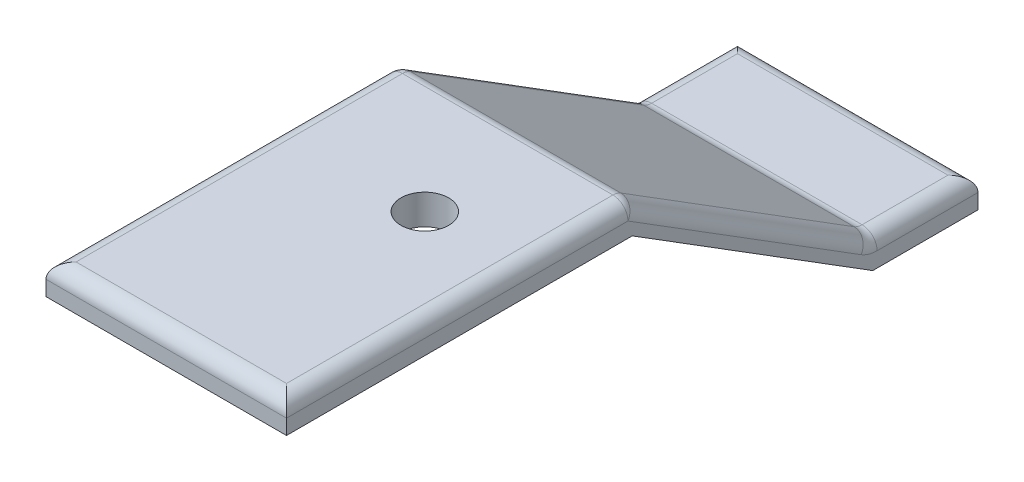
ISO-10303-21;
HEADER;
FILE_DESCRIPTION(('STEP AP214'),'2;1');
FILE_NAME('part.step','',(''),(''),'','','');
FILE_SCHEMA(('AUTOMOTIVE_DESIGN { 1 0 10303 214 1 1 1 1 }'));
ENDSEC;
DATA;
#1=APPLICATION_CONTEXT('core data for automotive mechanical design processes');
#2=APPLICATION_PROTOCOL_DEFINITION('international standard','automotive_design',2000,#1);
#3=PRODUCT_CONTEXT('',#1,'mechanical');
#4=PRODUCT('Part','Part','',(#3));
#5=PRODUCT_RELATED_PRODUCT_CATEGORY('part','',(#4));
#6=PRODUCT_DEFINITION_FORMATION('','',#4);
#7=PRODUCT_DEFINITION_CONTEXT('part definition',#1,'design');
#8=PRODUCT_DEFINITION('design','',#6,#7);
#9=PRODUCT_DEFINITION_SHAPE('','',#8);
#10=(LENGTH_UNIT() NAMED_UNIT(*) SI_UNIT(.MILLI.,.METRE.));
#11=(NAMED_UNIT(*) PLANE_ANGLE_UNIT() SI_UNIT($,.RADIAN.));
#12=(NAMED_UNIT(*) SI_UNIT($,.STERADIAN.) SOLID_ANGLE_UNIT());
#13=UNCERTAINTY_MEASURE_WITH_UNIT(LENGTH_MEASURE(1.E-05),#10,'distance_accuracy_value','');
#14=(GEOMETRIC_REPRESENTATION_CONTEXT(3) GLOBAL_UNCERTAINTY_ASSIGNED_CONTEXT((#13)) GLOBAL_UNIT_ASSIGNED_CONTEXT((#10,
#11,#12)) REPRESENTATION_CONTEXT('',''));
#15=CARTESIAN_POINT('',(0.,0.,0.));
#16=DIRECTION('',(0.,0.,1.));
#17=DIRECTION('',(1.,0.,0.));
#18=AXIS2_PLACEMENT_3D('',#15,#16,#17);
#19=CARTESIAN_POINT('',(0.,4.,0.));
#20=DIRECTION('',(1.,0.,0.));
#21=DIRECTION('',(0.,0.,-1.));
#22=AXIS2_PLACEMENT_3D('',#19,#20,#21);
#23=PLANE('',#22);
#24=CARTESIAN_POINT('',(0.,-14.,-78.5735924528226));
#25=DIRECTION('',(1.,0.,0.));
#26=DIRECTION('',(0.,0.,-1.));
#27=AXIS2_PLACEMENT_3D('',#24,#25,#26);
#28=CIRCLE('',#27,4.);
#29=CARTESIAN_POINT('',(0.,-18.,-78.5735924528226));
#30=VERTEX_POINT('',#29);
#31=CARTESIAN_POINT('',(0.,-17.3919932160203,-76.4535966928099));
#32=VERTEX_POINT('',#31);
#33=EDGE_CURVE('E61',#30,#32,#28,.F.);
#34=ORIENTED_EDGE('',*,*,#33,.F.);
#35=DIRECTION('',(0.,0.,-1.));
#36=VECTOR('',#35,1.);
#37=CARTESIAN_POINT('',(0.,-18.,0.));
#38=LINE('',#37,#36);
#39=CARTESIAN_POINT('',(0.,-18.,-92.));
#40=VERTEX_POINT('',#39);
#41=EDGE_CURVE('E259',#30,#40,#38,.T.);
#42=ORIENTED_EDGE('',*,*,#41,.T.);
#43=DIRECTION('',(0.,1.,0.));
#44=VECTOR('',#43,1.);
#45=CARTESIAN_POINT('',(0.,0.,-92.));
#46=LINE('',#45,#44);
#47=CARTESIAN_POINT('',(0.,-20.,-92.));
#48=VERTEX_POINT('',#47);
#49=EDGE_CURVE('E163',#48,#40,#46,.T.);
#50=ORIENTED_EDGE('',*,*,#49,.F.);
#51=DIRECTION('',(0.,0.,-1.));
#52=VECTOR('',#51,1.);
#53=CARTESIAN_POINT('',(0.,-20.,0.));
#54=LINE('',#53,#52);
#55=CARTESIAN_POINT('',(0.,-20.,-78.));
#56=VERTEX_POINT('',#55);
#57=EDGE_CURVE('E172',#56,#48,#54,.T.);
#58=ORIENTED_EDGE('',*,*,#57,.F.);
#59=DIRECTION('',(0.,-0.52999894000318,-0.847998304005088));
#60=VECTOR('',#59,1.);
#61=CARTESIAN_POINT('',(0.,20.6741573033708,-12.9213483146067));
#62=LINE('',#61,#60);
#63=CARTESIAN_POINT('',(0.,0.,-46.));
#64=VERTEX_POINT('',#63);
#65=EDGE_CURVE('E154',#64,#56,#62,.T.);
#66=ORIENTED_EDGE('',*,*,#65,.F.);
#67=DIRECTION('',(0.,0.,1.));
#68=VECTOR('',#67,1.);
#69=CARTESIAN_POINT('',(0.,0.,0.));
#70=LINE('',#69,#68);
#71=CARTESIAN_POINT('',(0.,0.,0.));
#72=VERTEX_POINT('',#71);
#73=EDGE_CURVE('E168',#64,#72,#70,.T.);
#74=ORIENTED_EDGE('',*,*,#73,.T.);
#75=DIRECTION('',(0.,-1.,0.));
#76=VECTOR('',#75,1.);
#77=CARTESIAN_POINT('',(0.,4.,0.));
#78=LINE('',#77,#76);
#79=CARTESIAN_POINT('',(0.,2.,0.));
#80=VERTEX_POINT('',#79);
#81=EDGE_CURVE('E197',#80,#72,#78,.T.);
#82=ORIENTED_EDGE('',*,*,#81,.F.);
#83=DIRECTION('',(0.,0.,1.));
#84=VECTOR('',#83,1.);
#85=CARTESIAN_POINT('',(0.,2.,0.));
#86=LINE('',#85,#84);
#87=CARTESIAN_POINT('',(0.,2.,-45.4264075471774));
#88=VERTEX_POINT('',#87);
#89=EDGE_CURVE('E252',#80,#88,#86,.F.);
#90=ORIENTED_EDGE('',*,*,#89,.T.);
#91=DIRECTION('',(0.,-0.52999894000318,-0.847998304005088));
#92=VECTOR('',#91,1.);
#93=CARTESIAN_POINT('',(0.,22.9781606953606,-11.8613504346004));
#94=LINE('',#93,#92);
#95=EDGE_CURVE('E66',#88,#32,#94,.T.);
#96=ORIENTED_EDGE('',*,*,#95,.T.);
#97=EDGE_LOOP('',(#34,#42,#50,#58,#66,#74,#82,#90,#96));
#98=FACE_BOUND('',#97,.T.);
#99=ADVANCED_FACE('F43',(#98),#23,.F.);
#100=CARTESIAN_POINT('',(0.,4.,0.));
#101=DIRECTION('',(0.,0.,-1.));
#102=DIRECTION('',(-1.,0.,0.));
#103=AXIS2_PLACEMENT_3D('',#100,#101,#102);
#104=PLANE('',#103);
#105=DIRECTION('',(0.,-1.,0.));
#106=VECTOR('',#105,1.);
#107=CARTESIAN_POINT('',(32.,4.,0.));
#108=LINE('',#107,#106);
#109=CARTESIAN_POINT('',(32.,2.,0.));
#110=VERTEX_POINT('',#109);
#111=CARTESIAN_POINT('',(32.,0.,0.));
#112=VERTEX_POINT('',#111);
#113=EDGE_CURVE('E194',#110,#112,#108,.T.);
#114=ORIENTED_EDGE('',*,*,#113,.F.);
#115=DIRECTION('',(1.,0.,0.));
#116=VECTOR('',#115,1.);
#117=CARTESIAN_POINT('',(0.,2.,0.));
#118=LINE('',#117,#116);
#119=EDGE_CURVE('E53',#110,#80,#118,.F.);
#120=ORIENTED_EDGE('',*,*,#119,.T.);
#121=ORIENTED_EDGE('',*,*,#81,.T.);
#122=DIRECTION('',(1.,0.,0.));
#123=VECTOR('',#122,1.);
#124=CARTESIAN_POINT('',(0.,0.,0.));
#125=LINE('',#124,#123);
#126=EDGE_CURVE('E179',#72,#112,#125,.T.);
#127=ORIENTED_EDGE('',*,*,#126,.T.);
#128=EDGE_LOOP('',(#114,#120,#121,#127));
#129=FACE_BOUND('',#128,.T.);
#130=ADVANCED_FACE('F401',(#129),#104,.F.);
#131=CARTESIAN_POINT('',(32.,4.,0.));
#132=DIRECTION('',(-1.,0.,0.));
#133=DIRECTION('',(0.,0.,1.));
#134=AXIS2_PLACEMENT_3D('',#131,#132,#133);
#135=PLANE('',#134);
#136=DIRECTION('',(0.,1.,0.));
#137=VECTOR('',#136,1.);
#138=CARTESIAN_POINT('',(32.,0.,-92.));
#139=LINE('',#138,#137);
#140=CARTESIAN_POINT('',(32.,-20.,-92.));
#141=VERTEX_POINT('',#140);
#142=CARTESIAN_POINT('',(32.,-18.,-92.));
#143=VERTEX_POINT('',#142);
#144=EDGE_CURVE('E174',#141,#143,#139,.T.);
#145=ORIENTED_EDGE('',*,*,#144,.T.);
#146=DIRECTION('',(0.,0.,-1.));
#147=VECTOR('',#146,1.);
#148=CARTESIAN_POINT('',(32.,-18.,0.));
#149=LINE('',#148,#147);
#150=CARTESIAN_POINT('',(32.,-18.,-78.5735924528226));
#151=VERTEX_POINT('',#150);
#152=EDGE_CURVE('E248',#143,#151,#149,.F.);
#153=ORIENTED_EDGE('',*,*,#152,.T.);
#154=CARTESIAN_POINT('',(32.,-14.,-78.5735924528226));
#155=DIRECTION('',(-1.,0.,0.));
#156=DIRECTION('',(0.,0.,1.));
#157=AXIS2_PLACEMENT_3D('',#154,#155,#156);
#158=CIRCLE('',#157,4.);
#159=CARTESIAN_POINT('',(32.,-17.3919932160203,-76.4535966928099));
#160=VERTEX_POINT('',#159);
#161=EDGE_CURVE('E245',#160,#151,#158,.F.);
#162=ORIENTED_EDGE('',*,*,#161,.F.);
#163=DIRECTION('',(0.,-0.52999894000318,-0.847998304005088));
#164=VECTOR('',#163,1.);
#165=CARTESIAN_POINT('',(32.,22.9781606953606,-11.8613504346004));
#166=LINE('',#165,#164);
#167=CARTESIAN_POINT('',(32.,2.,-45.4264075471774));
#168=VERTEX_POINT('',#167);
#169=EDGE_CURVE('E242',#160,#168,#166,.F.);
#170=ORIENTED_EDGE('',*,*,#169,.T.);
#171=DIRECTION('',(0.,0.,-1.));
#172=VECTOR('',#171,1.);
#173=CARTESIAN_POINT('',(32.,2.,0.));
#174=LINE('',#173,#172);
#175=EDGE_CURVE('E239',#168,#110,#174,.F.);
#176=ORIENTED_EDGE('',*,*,#175,.T.);
#177=ORIENTED_EDGE('',*,*,#113,.T.);
#178=DIRECTION('',(0.,0.,-1.));
#179=VECTOR('',#178,1.);
#180=CARTESIAN_POINT('',(32.,0.,0.));
#181=LINE('',#180,#179);
#182=CARTESIAN_POINT('',(32.,0.,-46.));
#183=VERTEX_POINT('',#182);
#184=EDGE_CURVE('E185',#112,#183,#181,.T.);
#185=ORIENTED_EDGE('',*,*,#184,.T.);
#186=DIRECTION('',(0.,-0.52999894000318,-0.847998304005088));
#187=VECTOR('',#186,1.);
#188=CARTESIAN_POINT('',(32.,20.6741573033708,-12.9213483146067));
#189=LINE('',#188,#187);
#190=CARTESIAN_POINT('',(32.,-20.,-78.));
#191=VERTEX_POINT('',#190);
#192=EDGE_CURVE('E156',#183,#191,#189,.T.);
#193=ORIENTED_EDGE('',*,*,#192,.T.);
#194=DIRECTION('',(0.,0.,-1.));
#195=VECTOR('',#194,1.);
#196=CARTESIAN_POINT('',(32.,-20.,0.));
#197=LINE('',#196,#195);
#198=EDGE_CURVE('E330',#191,#141,#197,.T.);
#199=ORIENTED_EDGE('',*,*,#198,.T.);
#200=EDGE_LOOP('',(#145,#153,#162,#170,#176,#177,#185,#193,#199));
#201=FACE_BOUND('',#200,.T.);
#202=ADVANCED_FACE('F350',(#201),#135,.F.);
#203=CARTESIAN_POINT('',(0.,4.,0.));
#204=DIRECTION('',(0.,-1.,0.));
#205=DIRECTION('',(0.,0.,-1.));
#206=AXIS2_PLACEMENT_3D('',#203,#204,#205);
#207=PLANE('',#206);
#208=DIRECTION('',(0.,0.,-1.));
#209=VECTOR('',#208,1.);
#210=CARTESIAN_POINT('',(30.,4.,0.));
#211=LINE('',#210,#209);
#212=CARTESIAN_POINT('',(30.,4.,-2.));
#213=VERTEX_POINT('',#212);
#214=CARTESIAN_POINT('',(30.,4.,-45.4264075471774));
#215=VERTEX_POINT('',#214);
#216=EDGE_CURVE('E229',#213,#215,#211,.T.);
#217=ORIENTED_EDGE('',*,*,#216,.T.);
#218=DIRECTION('',(1.,0.,0.));
#219=VECTOR('',#218,1.);
#220=CARTESIAN_POINT('',(0.,4.,-45.4264075471774));
#221=LINE('',#220,#219);
#222=CARTESIAN_POINT('',(2.,4.,-45.4264075471774));
#223=VERTEX_POINT('',#222);
#224=EDGE_CURVE('E235',#215,#223,#221,.F.);
#225=ORIENTED_EDGE('',*,*,#224,.T.);
#226=DIRECTION('',(0.,0.,1.));
#227=VECTOR('',#226,1.);
#228=CARTESIAN_POINT('',(2.,4.,0.));
#229=LINE('',#228,#227);
#230=CARTESIAN_POINT('',(2.,4.,-2.));
#231=VERTEX_POINT('',#230);
#232=EDGE_CURVE('E232',#223,#231,#229,.T.);
#233=ORIENTED_EDGE('',*,*,#232,.T.);
#234=DIRECTION('',(1.,0.,0.));
#235=VECTOR('',#234,1.);
#236=CARTESIAN_POINT('',(0.,4.,-2.));
#237=LINE('',#236,#235);
#238=EDGE_CURVE('E226',#231,#213,#237,.T.);
#239=ORIENTED_EDGE('',*,*,#238,.T.);
#240=EDGE_LOOP('',(#217,#225,#233,#239));
#241=FACE_BOUND('',#240,.T.);
#242=CARTESIAN_POINT('',(19.4,4.,-31.));
#243=DIRECTION('',(0.,1.,0.));
#244=DIRECTION('',(0.,0.,1.));
#245=AXIS2_PLACEMENT_3D('',#242,#243,#244);
#246=CIRCLE('',#245,3.175);
#247=CARTESIAN_POINT('',(19.4,4.,-27.825));
#248=VERTEX_POINT('',#247);
#249=EDGE_CURVE('E188',#248,#248,#246,.T.);
#250=ORIENTED_EDGE('',*,*,#249,.F.);
#251=EDGE_LOOP('',(#250));
#252=FACE_BOUND('',#251,.T.);
#253=ADVANCED_FACE('F552',(#241,#252),#207,.F.);
#254=CARTESIAN_POINT('',(0.,0.,0.));
#255=DIRECTION('',(0.,-1.,0.));
#256=DIRECTION('',(0.,0.,-1.));
#257=AXIS2_PLACEMENT_3D('',#254,#255,#256);
#258=PLANE('',#257);
#259=DIRECTION('',(1.,0.,0.));
#260=VECTOR('',#259,1.);
#261=CARTESIAN_POINT('',(0.,0.,-46.));
#262=LINE('',#261,#260);
#263=EDGE_CURVE('E151',#64,#183,#262,.T.);
#264=ORIENTED_EDGE('',*,*,#263,.T.);
#265=ORIENTED_EDGE('',*,*,#184,.F.);
#266=ORIENTED_EDGE('',*,*,#126,.F.);
#267=ORIENTED_EDGE('',*,*,#73,.F.);
#268=EDGE_LOOP('',(#264,#265,#266,#267));
#269=FACE_BOUND('',#268,.T.);
#270=CARTESIAN_POINT('',(19.4,0.,-31.));
#271=DIRECTION('',(0.,1.,0.));
#272=DIRECTION('',(0.,0.,1.));
#273=AXIS2_PLACEMENT_3D('',#270,#271,#272);
#274=CIRCLE('',#273,3.175);
#275=CARTESIAN_POINT('',(19.4,0.,-27.825));
#276=VERTEX_POINT('',#275);
#277=EDGE_CURVE('E181',#276,#276,#274,.T.);
#278=ORIENTED_EDGE('',*,*,#277,.T.);
#279=EDGE_LOOP('',(#278));
#280=FACE_BOUND('',#279,.T.);
#281=ADVANCED_FACE('F176',(#269,#280),#258,.T.);
#282=CARTESIAN_POINT('',(19.4,0.,-31.));
#283=DIRECTION('',(0.,1.,0.));
#284=DIRECTION('',(0.,0.,1.));
#285=AXIS2_PLACEMENT_3D('',#282,#283,#284);
#286=CYLINDRICAL_SURFACE('',#285,3.175);
#287=ORIENTED_EDGE('',*,*,#277,.F.);
#288=EDGE_LOOP('',(#287));
#289=FACE_BOUND('',#288,.T.);
#290=ORIENTED_EDGE('',*,*,#249,.T.);
#291=EDGE_LOOP('',(#290));
#292=FACE_BOUND('',#291,.T.);
#293=ADVANCED_FACE('F547',(#289,#292),#286,.F.);
#294=CARTESIAN_POINT('',(0.,-16.,0.));
#295=DIRECTION('',(0.,-1.,0.));
#296=DIRECTION('',(0.,0.,-1.));
#297=AXIS2_PLACEMENT_3D('',#294,#295,#296);
#298=PLANE('',#297);
#299=DIRECTION('',(0.,0.,-1.));
#300=VECTOR('',#299,1.);
#301=CARTESIAN_POINT('',(2.,-16.,0.));
#302=LINE('',#301,#300);
#303=CARTESIAN_POINT('',(2.,-16.,-90.));
#304=VERTEX_POINT('',#303);
#305=CARTESIAN_POINT('',(2.,-16.,-78.5735924528226));
#306=VERTEX_POINT('',#305);
#307=EDGE_CURVE('E203',#304,#306,#302,.F.);
#308=ORIENTED_EDGE('',*,*,#307,.T.);
#309=DIRECTION('',(1.,0.,0.));
#310=VECTOR('',#309,1.);
#311=CARTESIAN_POINT('',(32.,-16.,-78.5735924528226));
#312=LINE('',#311,#310);
#313=CARTESIAN_POINT('',(30.,-16.,-78.5735924528226));
#314=VERTEX_POINT('',#313);
#315=EDGE_CURVE('E209',#306,#314,#312,.T.);
#316=ORIENTED_EDGE('',*,*,#315,.T.);
#317=DIRECTION('',(0.,0.,-1.));
#318=VECTOR('',#317,1.);
#319=CARTESIAN_POINT('',(30.,-16.,0.));
#320=LINE('',#319,#318);
#321=CARTESIAN_POINT('',(30.,-16.,-90.));
#322=VERTEX_POINT('',#321);
#323=EDGE_CURVE('E206',#314,#322,#320,.T.);
#324=ORIENTED_EDGE('',*,*,#323,.T.);
#325=DIRECTION('',(1.,0.,0.));
#326=VECTOR('',#325,1.);
#327=CARTESIAN_POINT('',(0.,-16.,-90.));
#328=LINE('',#327,#326);
#329=EDGE_CURVE('E200',#322,#304,#328,.F.);
#330=ORIENTED_EDGE('',*,*,#329,.T.);
#331=EDGE_LOOP('',(#308,#316,#324,#330));
#332=FACE_BOUND('',#331,.T.);
#333=ADVANCED_FACE('F367',(#332),#298,.F.);
#334=CARTESIAN_POINT('',(0.,0.,-92.));
#335=DIRECTION('',(0.,0.,-1.));
#336=DIRECTION('',(-1.,0.,0.));
#337=AXIS2_PLACEMENT_3D('',#334,#335,#336);
#338=PLANE('',#337);
#339=ORIENTED_EDGE('',*,*,#49,.T.);
#340=DIRECTION('',(1.,0.,0.));
#341=VECTOR('',#340,1.);
#342=CARTESIAN_POINT('',(32.,-18.,-92.));
#343=LINE('',#342,#341);
#344=EDGE_CURVE('E11',#40,#143,#343,.T.);
#345=ORIENTED_EDGE('',*,*,#344,.T.);
#346=ORIENTED_EDGE('',*,*,#144,.F.);
#347=DIRECTION('',(1.,0.,0.));
#348=VECTOR('',#347,1.);
#349=CARTESIAN_POINT('',(0.,-20.,-92.));
#350=LINE('',#349,#348);
#351=EDGE_CURVE('E342',#48,#141,#350,.T.);
#352=ORIENTED_EDGE('',*,*,#351,.F.);
#353=EDGE_LOOP('',(#339,#345,#346,#352));
#354=FACE_BOUND('',#353,.T.);
#355=ADVANCED_FACE('F354',(#354),#338,.T.);
#356=CARTESIAN_POINT('',(0.,-20.,0.));
#357=DIRECTION('',(0.,-1.,0.));
#358=DIRECTION('',(0.,0.,-1.));
#359=AXIS2_PLACEMENT_3D('',#356,#357,#358);
#360=PLANE('',#359);
#361=ORIENTED_EDGE('',*,*,#198,.F.);
#362=DIRECTION('',(1.,0.,0.));
#363=VECTOR('',#362,1.);
#364=CARTESIAN_POINT('',(0.,-20.,-78.));
#365=LINE('',#364,#363);
#366=EDGE_CURVE('E162',#56,#191,#365,.T.);
#367=ORIENTED_EDGE('',*,*,#366,.F.);
#368=ORIENTED_EDGE('',*,*,#57,.T.);
#369=ORIENTED_EDGE('',*,*,#351,.T.);
#370=EDGE_LOOP('',(#361,#367,#368,#369));
#371=FACE_BOUND('',#370,.T.);
#372=ADVANCED_FACE('F348',(#371),#360,.T.);
#373=CARTESIAN_POINT('',(0.,20.6741573033708,-12.9213483146067));
#374=DIRECTION('',(0.,-0.847998304005088,0.52999894000318));
#375=DIRECTION('',(0.,-0.52999894000318,-0.847998304005088));
#376=AXIS2_PLACEMENT_3D('',#373,#374,#375);
#377=PLANE('',#376);
#378=ORIENTED_EDGE('',*,*,#192,.F.);
#379=ORIENTED_EDGE('',*,*,#263,.F.);
#380=ORIENTED_EDGE('',*,*,#65,.T.);
#381=ORIENTED_EDGE('',*,*,#366,.T.);
#382=EDGE_LOOP('',(#378,#379,#380,#381));
#383=FACE_BOUND('',#382,.T.);
#384=ADVANCED_FACE('F153',(#383),#377,.T.);
#385=CARTESIAN_POINT('',(0.,23.5505617977528,-14.7191011235955));
#386=DIRECTION('',(0.,-0.847998304005088,0.52999894000318));
#387=DIRECTION('',(0.,-0.52999894000318,-0.847998304005088));
#388=AXIS2_PLACEMENT_3D('',#385,#386,#387);
#389=PLANE('',#388);
#390=DIRECTION('',(1.,0.,0.));
#391=VECTOR('',#390,1.);
#392=CARTESIAN_POINT('',(0.,-15.6959966080102,-77.5135945728163));
#393=LINE('',#392,#391);
#394=CARTESIAN_POINT('',(30.,-15.6959966080102,-77.5135945728163));
#395=VERTEX_POINT('',#394);
#396=CARTESIAN_POINT('',(2.,-15.6959966080102,-77.5135945728163));
#397=VERTEX_POINT('',#396);
#398=EDGE_CURVE('E219',#395,#397,#393,.F.);
#399=ORIENTED_EDGE('',*,*,#398,.T.);
#400=DIRECTION('',(0.,-0.52999894000318,-0.847998304005088));
#401=VECTOR('',#400,1.);
#402=CARTESIAN_POINT('',(2.,23.5505617977528,-14.7191011235955));
#403=LINE('',#402,#401);
#404=CARTESIAN_POINT('',(2.,3.69599660801017,-46.4864054271837));
#405=VERTEX_POINT('',#404);
#406=EDGE_CURVE('E223',#397,#405,#403,.F.);
#407=ORIENTED_EDGE('',*,*,#406,.T.);
#408=DIRECTION('',(1.,0.,0.));
#409=VECTOR('',#408,1.);
#410=CARTESIAN_POINT('',(0.,3.69599660801017,-46.4864054271837));
#411=LINE('',#410,#409);
#412=CARTESIAN_POINT('',(30.,3.69599660801017,-46.4864054271837));
#413=VERTEX_POINT('',#412);
#414=EDGE_CURVE('E216',#405,#413,#411,.T.);
#415=ORIENTED_EDGE('',*,*,#414,.T.);
#416=DIRECTION('',(0.,-0.52999894000318,-0.847998304005088));
#417=VECTOR('',#416,1.);
#418=CARTESIAN_POINT('',(30.,23.5505617977528,-14.7191011235955));
#419=LINE('',#418,#417);
#420=EDGE_CURVE('E213',#413,#395,#419,.T.);
#421=ORIENTED_EDGE('',*,*,#420,.T.);
#422=EDGE_LOOP('',(#399,#407,#415,#421));
#423=FACE_BOUND('',#422,.T.);
#424=ADVANCED_FACE('F386',(#423),#389,.F.);
#425=CARTESIAN_POINT('',(0.,2.,-2.));
#426=DIRECTION('',(1.,0.,0.));
#427=DIRECTION('',(0.,0.,-1.));
#428=AXIS2_PLACEMENT_3D('',#425,#426,#427);
#429=CYLINDRICAL_SURFACE('',#428,2.);
#430=CARTESIAN_POINT('',(30.,2.,-2.));
#431=DIRECTION('',(0.707106781186547,0.,-0.707106781186547));
#432=DIRECTION('',(0.707106781186547,0.,0.707106781186547));
#433=AXIS2_PLACEMENT_3D('',#430,#431,#432);
#434=ELLIPSE('',#433,2.82842712474619,2.);
#435=EDGE_CURVE('E316',#213,#110,#434,.T.);
#436=ORIENTED_EDGE('',*,*,#435,.F.);
#437=ORIENTED_EDGE('',*,*,#238,.F.);
#438=CARTESIAN_POINT('',(2.,2.,-2.));
#439=DIRECTION('',(0.707106781186547,0.,0.707106781186547));
#440=DIRECTION('',(0.707106781186547,0.,-0.707106781186547));
#441=AXIS2_PLACEMENT_3D('',#438,#439,#440);
#442=ELLIPSE('',#441,2.82842712474619,2.);
#443=EDGE_CURVE('E47',#80,#231,#442,.F.);
#444=ORIENTED_EDGE('',*,*,#443,.F.);
#445=ORIENTED_EDGE('',*,*,#119,.F.);
#446=EDGE_LOOP('',(#436,#437,#444,#445));
#447=FACE_BOUND('',#446,.T.);
#448=ADVANCED_FACE('F45',(#447),#429,.T.);
#449=CARTESIAN_POINT('',(2.,2.,0.));
#450=DIRECTION('',(0.,0.,1.));
#451=DIRECTION('',(1.,0.,0.));
#452=AXIS2_PLACEMENT_3D('',#449,#450,#451);
#453=CYLINDRICAL_SURFACE('',#452,2.);
#454=ORIENTED_EDGE('',*,*,#443,.T.);
#455=ORIENTED_EDGE('',*,*,#232,.F.);
#456=CARTESIAN_POINT('',(2.,2.,-45.4264075471774));
#457=DIRECTION('',(0.,0.,-1.));
#458=DIRECTION('',(0.,1.,0.));
#459=AXIS2_PLACEMENT_3D('',#456,#457,#458);
#460=CIRCLE('',#459,2.);
#461=EDGE_CURVE('E310',#88,#223,#460,.T.);
#462=ORIENTED_EDGE('',*,*,#461,.F.);
#463=ORIENTED_EDGE('',*,*,#89,.F.);
#464=EDGE_LOOP('',(#454,#455,#462,#463));
#465=FACE_BOUND('',#464,.T.);
#466=ADVANCED_FACE('F405',(#465),#453,.T.);
#467=CARTESIAN_POINT('',(30.,2.,0.));
#468=DIRECTION('',(0.,0.,-1.));
#469=DIRECTION('',(-1.,0.,0.));
#470=AXIS2_PLACEMENT_3D('',#467,#468,#469);
#471=CYLINDRICAL_SURFACE('',#470,2.);
#472=ORIENTED_EDGE('',*,*,#435,.T.);
#473=ORIENTED_EDGE('',*,*,#175,.F.);
#474=CARTESIAN_POINT('',(30.,2.,-45.4264075471774));
#475=DIRECTION('',(0.,0.,-1.));
#476=DIRECTION('',(-1.,0.,0.));
#477=AXIS2_PLACEMENT_3D('',#474,#475,#476);
#478=CIRCLE('',#477,2.);
#479=EDGE_CURVE('E306',#215,#168,#478,.T.);
#480=ORIENTED_EDGE('',*,*,#479,.F.);
#481=ORIENTED_EDGE('',*,*,#216,.F.);
#482=EDGE_LOOP('',(#472,#473,#480,#481));
#483=FACE_BOUND('',#482,.T.);
#484=ADVANCED_FACE('F397',(#483),#471,.T.);
#485=CARTESIAN_POINT('',(0.,2.,-45.4264075471774));
#486=DIRECTION('',(1.,0.,0.));
#487=DIRECTION('',(0.,0.,-1.));
#488=AXIS2_PLACEMENT_3D('',#485,#486,#487);
#489=CYLINDRICAL_SURFACE('',#488,2.);
#490=CARTESIAN_POINT('',(2.,2.,-45.4264075471774));
#491=DIRECTION('',(-1.,0.,0.));
#492=DIRECTION('',(0.,0.,1.));
#493=AXIS2_PLACEMENT_3D('',#490,#491,#492);
#494=CIRCLE('',#493,2.);
#495=EDGE_CURVE('E313',#223,#405,#494,.T.);
#496=ORIENTED_EDGE('',*,*,#495,.F.);
#497=ORIENTED_EDGE('',*,*,#224,.F.);
#498=CARTESIAN_POINT('',(30.,2.,-45.4264075471774));
#499=DIRECTION('',(1.,0.,0.));
#500=DIRECTION('',(0.,0.,-1.));
#501=AXIS2_PLACEMENT_3D('',#498,#499,#500);
#502=CIRCLE('',#501,2.);
#503=EDGE_CURVE('E302',#413,#215,#502,.T.);
#504=ORIENTED_EDGE('',*,*,#503,.F.);
#505=ORIENTED_EDGE('',*,*,#414,.F.);
#506=EDGE_LOOP('',(#496,#497,#504,#505));
#507=FACE_BOUND('',#506,.T.);
#508=ADVANCED_FACE('F393',(#507),#489,.T.);
#509=CARTESIAN_POINT('',(2.,2.,-45.4264075471774));
#510=DIRECTION('',(0.,0.,1.));
#511=DIRECTION('',(1.,0.,0.));
#512=AXIS2_PLACEMENT_3D('',#509,#510,#511);
#513=SPHERICAL_SURFACE('',#512,2.);
#514=ORIENTED_EDGE('',*,*,#461,.T.);
#515=ORIENTED_EDGE('',*,*,#495,.T.);
#516=CARTESIAN_POINT('',(2.,2.,-45.4264075471774));
#517=DIRECTION('',(0.,0.52999894000318,0.847998304005088));
#518=DIRECTION('',(0.,-0.847998304005088,0.52999894000318));
#519=AXIS2_PLACEMENT_3D('',#516,#517,#518);
#520=CIRCLE('',#519,2.);
#521=EDGE_CURVE('E298',#88,#405,#520,.F.);
#522=ORIENTED_EDGE('',*,*,#521,.F.);
#523=EDGE_LOOP('',(#514,#515,#522));
#524=FACE_BOUND('',#523,.T.);
#525=ADVANCED_FACE('F408',(#524),#513,.T.);
#526=CARTESIAN_POINT('',(0.,-18.,-90.));
#527=DIRECTION('',(-1.,0.,0.));
#528=DIRECTION('',(0.,0.,1.));
#529=AXIS2_PLACEMENT_3D('',#526,#527,#528);
#530=CYLINDRICAL_SURFACE('',#529,2.);
#531=CARTESIAN_POINT('',(30.,-18.,-90.));
#532=DIRECTION('',(-0.707106781186547,0.,-0.707106781186547));
#533=DIRECTION('',(-0.707106781186547,0.,0.707106781186547));
#534=AXIS2_PLACEMENT_3D('',#531,#532,#533);
#535=ELLIPSE('',#534,2.82842712474619,2.);
#536=EDGE_CURVE('E290',#143,#322,#535,.F.);
#537=ORIENTED_EDGE('',*,*,#536,.F.);
#538=ORIENTED_EDGE('',*,*,#344,.F.);
#539=CARTESIAN_POINT('',(2.,-18.,-90.));
#540=DIRECTION('',(-0.707106781186547,0.,0.707106781186547));
#541=DIRECTION('',(-0.707106781186547,0.,-0.707106781186547));
#542=AXIS2_PLACEMENT_3D('',#539,#540,#541);
#543=ELLIPSE('',#542,2.82842712474619,2.);
#544=EDGE_CURVE('E294',#304,#40,#543,.T.);
#545=ORIENTED_EDGE('',*,*,#544,.F.);
#546=ORIENTED_EDGE('',*,*,#329,.F.);
#547=EDGE_LOOP('',(#537,#538,#545,#546));
#548=FACE_BOUND('',#547,.T.);
#549=ADVANCED_FACE('F358',(#548),#530,.T.);
#550=CARTESIAN_POINT('',(30.,2.,-45.4264075471774));
#551=DIRECTION('',(0.,0.,1.));
#552=DIRECTION('',(1.,0.,0.));
#553=AXIS2_PLACEMENT_3D('',#550,#551,#552);
#554=SPHERICAL_SURFACE('',#553,2.);
#555=ORIENTED_EDGE('',*,*,#503,.T.);
#556=ORIENTED_EDGE('',*,*,#479,.T.);
#557=CARTESIAN_POINT('',(30.,2.,-45.4264075471774));
#558=DIRECTION('',(0.,0.529998940003183,0.847998304005086));
#559=DIRECTION('',(0.,-0.847998304005086,0.529998940003183));
#560=AXIS2_PLACEMENT_3D('',#557,#558,#559);
#561=CIRCLE('',#560,2.);
#562=EDGE_CURVE('E286',#413,#168,#561,.F.);
#563=ORIENTED_EDGE('',*,*,#562,.F.);
#564=EDGE_LOOP('',(#555,#556,#563));
#565=FACE_BOUND('',#564,.T.);
#566=ADVANCED_FACE('F396',(#565),#554,.T.);
#567=CARTESIAN_POINT('',(2.,22.9781606953606,-11.8613504346004));
#568=DIRECTION('',(0.,-0.52999894000318,-0.847998304005088));
#569=DIRECTION('',(0.,0.847998304005088,-0.52999894000318));
#570=AXIS2_PLACEMENT_3D('',#567,#568,#569);
#571=CYLINDRICAL_SURFACE('',#570,2.);
#572=ORIENTED_EDGE('',*,*,#521,.T.);
#573=ORIENTED_EDGE('',*,*,#406,.F.);
#574=CARTESIAN_POINT('',(2.,-17.3919932160203,-76.4535966928099));
#575=DIRECTION('',(0.,-0.529998940003183,-0.847998304005086));
#576=DIRECTION('',(0.,0.847998304005086,-0.529998940003183));
#577=AXIS2_PLACEMENT_3D('',#574,#575,#576);
#578=CIRCLE('',#577,2.);
#579=EDGE_CURVE('E282',#32,#397,#578,.T.);
#580=ORIENTED_EDGE('',*,*,#579,.F.);
#581=ORIENTED_EDGE('',*,*,#95,.F.);
#582=EDGE_LOOP('',(#572,#573,#580,#581));
#583=FACE_BOUND('',#582,.T.);
#584=ADVANCED_FACE('F410',(#583),#571,.T.);
#585=CARTESIAN_POINT('',(2.,-18.,0.));
#586=DIRECTION('',(0.,0.,-1.));
#587=DIRECTION('',(-1.,0.,0.));
#588=AXIS2_PLACEMENT_3D('',#585,#586,#587);
#589=CYLINDRICAL_SURFACE('',#588,2.);
#590=ORIENTED_EDGE('',*,*,#544,.T.);
#591=ORIENTED_EDGE('',*,*,#41,.F.);
#592=CARTESIAN_POINT('',(2.,-18.,-78.5735924528226));
#593=DIRECTION('',(0.,0.,1.));
#594=DIRECTION('',(1.,0.,0.));
#595=AXIS2_PLACEMENT_3D('',#592,#593,#594);
#596=CIRCLE('',#595,2.);
#597=EDGE_CURVE('E278',#306,#30,#596,.T.);
#598=ORIENTED_EDGE('',*,*,#597,.F.);
#599=ORIENTED_EDGE('',*,*,#307,.F.);
#600=EDGE_LOOP('',(#590,#591,#598,#599));
#601=FACE_BOUND('',#600,.T.);
#602=ADVANCED_FACE('F363',(#601),#589,.T.);
#603=CARTESIAN_POINT('',(30.,-18.,0.));
#604=DIRECTION('',(0.,0.,-1.));
#605=DIRECTION('',(-1.,0.,0.));
#606=AXIS2_PLACEMENT_3D('',#603,#604,#605);
#607=CYLINDRICAL_SURFACE('',#606,2.);
#608=ORIENTED_EDGE('',*,*,#536,.T.);
#609=ORIENTED_EDGE('',*,*,#323,.F.);
#610=CARTESIAN_POINT('',(30.,-18.,-78.5735924528226));
#611=DIRECTION('',(0.,0.,1.));
#612=DIRECTION('',(1.,0.,0.));
#613=AXIS2_PLACEMENT_3D('',#610,#611,#612);
#614=CIRCLE('',#613,2.);
#615=EDGE_CURVE('E274',#151,#314,#614,.T.);
#616=ORIENTED_EDGE('',*,*,#615,.F.);
#617=ORIENTED_EDGE('',*,*,#152,.F.);
#618=EDGE_LOOP('',(#608,#609,#616,#617));
#619=FACE_BOUND('',#618,.T.);
#620=ADVANCED_FACE('F371',(#619),#607,.T.);
#621=CARTESIAN_POINT('',(30.,21.8545651897426,-13.6591032435891));
#622=DIRECTION('',(0.,-0.52999894000318,-0.847998304005088));
#623=DIRECTION('',(0.,0.847998304005088,-0.52999894000318));
#624=AXIS2_PLACEMENT_3D('',#621,#622,#623);
#625=CYLINDRICAL_SURFACE('',#624,2.);
#626=ORIENTED_EDGE('',*,*,#562,.T.);
#627=ORIENTED_EDGE('',*,*,#169,.F.);
#628=CARTESIAN_POINT('',(30.,-17.3919932160203,-76.4535966928099));
#629=DIRECTION('',(0.,-0.529998940003182,-0.847998304005086));
#630=DIRECTION('',(0.,0.847998304005087,-0.529998940003182));
#631=AXIS2_PLACEMENT_3D('',#628,#629,#630);
#632=CIRCLE('',#631,2.);
#633=EDGE_CURVE('E270',#395,#160,#632,.T.);
#634=ORIENTED_EDGE('',*,*,#633,.F.);
#635=ORIENTED_EDGE('',*,*,#420,.F.);
#636=EDGE_LOOP('',(#626,#627,#634,#635));
#637=FACE_BOUND('',#636,.T.);
#638=ADVANCED_FACE('F377',(#637),#625,.T.);
#639=CARTESIAN_POINT('',(2.,-14.,-78.5735924528226));
#640=DIRECTION('',(1.,0.,0.));
#641=DIRECTION('',(0.,0.,-1.));
#642=AXIS2_PLACEMENT_3D('',#639,#640,#641);
#643=TOROIDAL_SURFACE('',#642,4.,2.);
#644=ORIENTED_EDGE('',*,*,#33,.T.);
#645=ORIENTED_EDGE('',*,*,#579,.T.);
#646=CARTESIAN_POINT('',(2.,-14.,-78.5735924528226));
#647=DIRECTION('',(1.,0.,0.));
#648=DIRECTION('',(0.,0.,-1.));
#649=AXIS2_PLACEMENT_3D('',#646,#647,#648);
#650=CIRCLE('',#649,2.);
#651=EDGE_CURVE('E267',#306,#397,#650,.F.);
#652=ORIENTED_EDGE('',*,*,#651,.F.);
#653=ORIENTED_EDGE('',*,*,#597,.T.);
#654=EDGE_LOOP('',(#644,#645,#652,#653));
#655=FACE_BOUND('',#654,.T.);
#656=ADVANCED_FACE('F412',(#655),#643,.T.);
#657=CARTESIAN_POINT('',(30.,-14.,-78.5735924528226));
#658=DIRECTION('',(-1.,0.,0.));
#659=DIRECTION('',(0.,0.,1.));
#660=AXIS2_PLACEMENT_3D('',#657,#658,#659);
#661=TOROIDAL_SURFACE('',#660,4.,2.);
#662=ORIENTED_EDGE('',*,*,#161,.T.);
#663=ORIENTED_EDGE('',*,*,#615,.T.);
#664=CARTESIAN_POINT('',(30.,-14.,-78.5735924528226));
#665=DIRECTION('',(-1.,0.,0.));
#666=DIRECTION('',(0.,0.,1.));
#667=AXIS2_PLACEMENT_3D('',#664,#665,#666);
#668=CIRCLE('',#667,2.);
#669=EDGE_CURVE('E264',#395,#314,#668,.F.);
#670=ORIENTED_EDGE('',*,*,#669,.F.);
#671=ORIENTED_EDGE('',*,*,#633,.T.);
#672=EDGE_LOOP('',(#662,#663,#670,#671));
#673=FACE_BOUND('',#672,.T.);
#674=ADVANCED_FACE('F382',(#673),#661,.T.);
#675=CARTESIAN_POINT('',(0.,-14.,-78.5735924528226));
#676=DIRECTION('',(-1.,0.,0.));
#677=DIRECTION('',(0.,0.,1.));
#678=AXIS2_PLACEMENT_3D('',#675,#676,#677);
#679=CYLINDRICAL_SURFACE('',#678,2.);
#680=ORIENTED_EDGE('',*,*,#651,.T.);
#681=ORIENTED_EDGE('',*,*,#398,.F.);
#682=ORIENTED_EDGE('',*,*,#669,.T.);
#683=ORIENTED_EDGE('',*,*,#315,.F.);
#684=EDGE_LOOP('',(#680,#681,#682,#683));
#685=FACE_BOUND('',#684,.T.);
#686=ADVANCED_FACE('F384',(#685),#679,.F.);
#687=CLOSED_SHELL('',(#99,#130,#202,#253,#281,#293,#333,#355,#372,#384,#424,#448,#466,#484,#508,
#525,#549,#566,#584,#602,#620,#638,#656,#674,#686));
#688=MANIFOLD_SOLID_BREP('B2',#687);
#689=ADVANCED_BREP_SHAPE_REPRESENTATION('',(#18,#688),#14);
#690=SHAPE_DEFINITION_REPRESENTATION(#9,#689);
ENDSEC;
END-ISO-10303-21;
